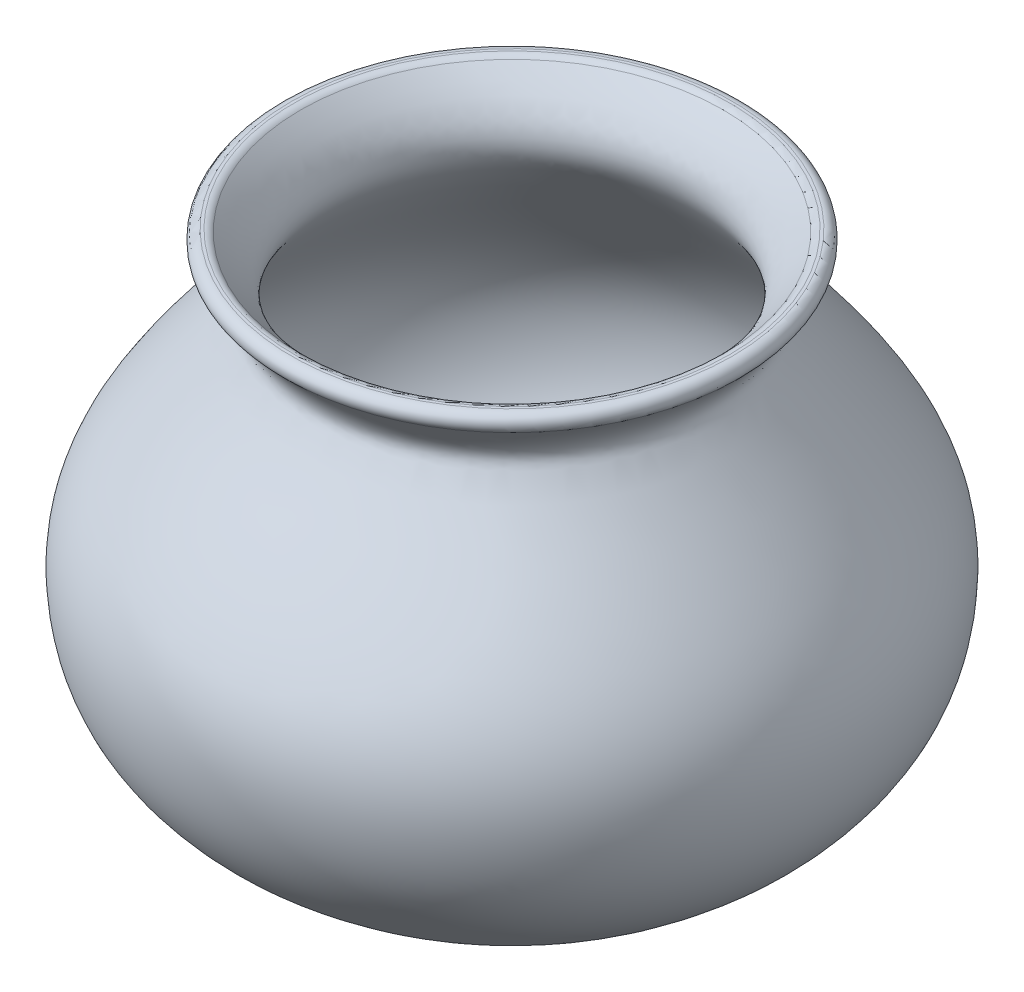
ISO-10303-21;
HEADER;
FILE_DESCRIPTION(('STEP AP214'),'2;1');
FILE_NAME('part.step','',(''),(''),'','','');
FILE_SCHEMA(('AUTOMOTIVE_DESIGN { 1 0 10303 214 1 1 1 1 }'));
ENDSEC;
DATA;
#1=APPLICATION_CONTEXT('core data for automotive mechanical design processes');
#2=APPLICATION_PROTOCOL_DEFINITION('international standard','automotive_design',2000,#1);
#3=PRODUCT_CONTEXT('',#1,'mechanical');
#4=PRODUCT('Part','Part','',(#3));
#5=PRODUCT_RELATED_PRODUCT_CATEGORY('part','',(#4));
#6=PRODUCT_DEFINITION_FORMATION('','',#4);
#7=PRODUCT_DEFINITION_CONTEXT('part definition',#1,'design');
#8=PRODUCT_DEFINITION('design','',#6,#7);
#9=PRODUCT_DEFINITION_SHAPE('','',#8);
#10=(LENGTH_UNIT() NAMED_UNIT(*) SI_UNIT(.MILLI.,.METRE.));
#11=(NAMED_UNIT(*) PLANE_ANGLE_UNIT() SI_UNIT($,.RADIAN.));
#12=(NAMED_UNIT(*) SI_UNIT($,.STERADIAN.) SOLID_ANGLE_UNIT());
#13=UNCERTAINTY_MEASURE_WITH_UNIT(LENGTH_MEASURE(1.E-05),#10,'distance_accuracy_value','');
#14=(GEOMETRIC_REPRESENTATION_CONTEXT(3) GLOBAL_UNCERTAINTY_ASSIGNED_CONTEXT((#13)) GLOBAL_UNIT_ASSIGNED_CONTEXT((#10,
#11,#12)) REPRESENTATION_CONTEXT('',''));
#15=CARTESIAN_POINT('',(0.,0.,0.));
#16=DIRECTION('',(0.,0.,1.));
#17=DIRECTION('',(1.,0.,0.));
#18=AXIS2_PLACEMENT_3D('',#15,#16,#17);
#19=CARTESIAN_POINT('',(0.,209.126185622765,-0.00765114113669776));
#20=DIRECTION('',(0.,-1.,0.));
#21=DIRECTION('',(1.,0.,0.));
#22=AXIS2_PLACEMENT_3D('',#19,#20,#21);
#23=PLANE('',#22);
#24=CARTESIAN_POINT('',(0.,209.126185622765,-0.00765114113669776));
#25=DIRECTION('',(0.,-1.,0.));
#26=DIRECTION('',(1.,0.,0.));
#27=AXIS2_PLACEMENT_3D('',#24,#25,#26);
#28=CIRCLE('',#27,89.7910064098729);
#29=CARTESIAN_POINT('',(89.7910064098728,209.126185622765,-0.00765114113669776));
#30=VERTEX_POINT('',#29);
#31=EDGE_CURVE('E93',#30,#30,#28,.F.);
#32=ORIENTED_EDGE('',*,*,#31,.T.);
#33=EDGE_LOOP('',(#32));
#34=FACE_BOUND('',#33,.T.);
#35=CARTESIAN_POINT('',(0.,209.126185622765,-0.00765114113669776));
#36=DIRECTION('',(0.,-1.,0.));
#37=DIRECTION('',(1.,0.,0.));
#38=AXIS2_PLACEMENT_3D('',#35,#36,#37);
#39=CIRCLE('',#38,88.6744297814408);
#40=CARTESIAN_POINT('',(88.6744297814408,209.126185622765,-0.00765114113669776));
#41=VERTEX_POINT('',#40);
#42=EDGE_CURVE('E87',#41,#41,#39,.T.);
#43=ORIENTED_EDGE('',*,*,#42,.T.);
#44=EDGE_LOOP('',(#43));
#45=FACE_BOUND('',#44,.T.);
#46=ADVANCED_FACE('F42',(#34,#45),#23,.F.);
#47=CARTESIAN_POINT('',(-2.27545171794154E-13,-4.23381437723537,-0.00765114113669776));
#48=CARTESIAN_POINT('',(17.0085612485199,-4.14377991760639,-0.00765114113669776));
#49=CARTESIAN_POINT('',(33.2490660723946,-1.4205350583226,-0.00765114113669776));
#50=CARTESIAN_POINT('',(64.8944542503649,6.20074467689256,-0.00765114113669776));
#51=CARTESIAN_POINT('',(124.831732128497,31.5800255656868,-0.00765114113669776));
#52=CARTESIAN_POINT('',(136.251179781009,93.640265937534,-0.00765114113669776));
#53=CARTESIAN_POINT('',(128.374972054001,127.37656177981,-0.00765114113669776));
#54=CARTESIAN_POINT('',(88.9657364865783,170.743340545911,-0.00765114113669776));
#55=CARTESIAN_POINT('',(79.3792931348029,187.417415181726,-0.00765114113669776));
#56=CARTESIAN_POINT('',(88.3982597834381,199.421967828531,-0.00765114113669776));
#57=CARTESIAN_POINT('',(96.7996082656881,206.519344267234,-0.00765114113669776));
#58=CARTESIAN_POINT('',(99.06,209.126185622765,-0.00765114113669776));
#59=B_SPLINE_CURVE_WITH_KNOTS('',3,(#47,#48,#49,#50,#51,#52,#53,#54,#55,#56,#57,#58),
.UNSPECIFIED.,.F.,.F.,(4,1,1,1,1,1,1,1,1,4),(0.,0.184861889340117,0.247829769261942,
0.587251129223108,0.642982067214919,0.762711479184906,0.900457012899512,0.919817645616506,
0.956317806354846,1.),.UNSPECIFIED.);
#60=CARTESIAN_POINT('',(0.,209.126185622765,-0.00765114113669776));
#61=DIRECTION('',(0.,1.,0.));
#62=AXIS1_PLACEMENT('',#60,#61);
#63=SURFACE_OF_REVOLUTION('',#59,#62);
#64=CARTESIAN_POINT('',(0.,202.584217575306,-0.00765114113669776));
#65=DIRECTION('',(0.,1.,0.));
#66=DIRECTION('',(-1.,0.,0.));
#67=AXIS2_PLACEMENT_3D('',#64,#65,#66);
#68=CIRCLE('',#67,92.4466514516026);
#69=CARTESIAN_POINT('',(-92.4466514516026,202.584217575306,-0.00765114113669776));
#70=VERTEX_POINT('',#69);
#71=EDGE_CURVE('E50',#70,#70,#68,.F.);
#72=ORIENTED_EDGE('',*,*,#71,.T.);
#73=EDGE_LOOP('',(#72));
#74=FACE_BOUND('',#73,.T.);
#75=CARTESIAN_POINT('',(0.,-4.23381437723537,-0.00765114113669776));
#76=VERTEX_POINT('',#75);
#77=VERTEX_LOOP('',#76);
#78=FACE_BOUND('',#77,.T.);
#79=ADVANCED_FACE('F59',(#74,#78),#63,.T.);
#80=CARTESIAN_POINT('',(0.0462255059895678,-4.23356483875475,-0.00765114113669776));
#81=CARTESIAN_POINT('',(17.0305147315768,-4.14009826120007,-0.00765114113669776));
#82=CARTESIAN_POINT('',(33.2580930015146,-1.4183610684955,-0.00765114113669776));
#83=CARTESIAN_POINT('',(64.8944542503649,6.20074467689256,-0.00765114113669776));
#84=CARTESIAN_POINT('',(124.831732128497,31.5800255656868,-0.00765114113669776));
#85=CARTESIAN_POINT('',(136.251179781009,93.640265937534,-0.00765114113669776));
#86=CARTESIAN_POINT('',(128.374972054001,127.37656177981,-0.00765114113669776));
#87=CARTESIAN_POINT('',(88.9657364865783,170.743340545911,-0.00765114113669776));
#88=CARTESIAN_POINT('',(79.3792931348029,187.417415181726,-0.00765114113669776));
#89=CARTESIAN_POINT('',(88.3982597834381,199.421967828531,-0.00765114113669776));
#90=CARTESIAN_POINT('',(96.7996082656881,206.519344267234,-0.00765114113669776));
#91=CARTESIAN_POINT('',(99.06,209.126185622765,-0.00765114113669776));
#92=B_SPLINE_CURVE_WITH_KNOTS('',3,(#80,#81,#82,#83,#84,#85,#86,#87,#88,#89,#90,#91),
.UNSPECIFIED.,.F.,.F.,(4,1,1,1,1,1,1,1,1,4),(0.000167514908944352,0.184861889340117,
0.247829769261942,0.587251129223108,0.642982067214919,0.762711479184906,0.900457012899512,
0.919817645616506,0.956317806354846,1.),.UNSPECIFIED.);
#93=CARTESIAN_POINT('',(0.,209.126185622765,-0.00765114113669776));
#94=DIRECTION('',(0.,1.,0.));
#95=AXIS1_PLACEMENT('',#93,#94);
#96=SURFACE_OF_REVOLUTION('',#92,#95);
#97=OFFSET_SURFACE('',#96,-8.4,.F.);
#98=CARTESIAN_POINT('',(0.,208.036339411358,-0.00765114113669776));
#99=DIRECTION('',(0.,1.,0.));
#100=DIRECTION('',(-1.,0.,0.));
#101=AXIS2_PLACEMENT_3D('',#98,#99,#100);
#102=CIRCLE('',#101,86.0066847849317);
#103=CARTESIAN_POINT('',(-86.0066847849318,208.036339411358,-0.00765114113669776));
#104=VERTEX_POINT('',#103);
#105=EDGE_CURVE('E11',#104,#104,#102,.T.);
#106=ORIENTED_EDGE('',*,*,#105,.T.);
#107=EDGE_LOOP('',(#106));
#108=FACE_BOUND('',#107,.T.);
#109=CARTESIAN_POINT('',(0.,4.16630796996063,-0.00765114113669776));
#110=VERTEX_POINT('',#109);
#111=VERTEX_LOOP('',#110);
#112=FACE_BOUND('',#111,.T.);
#113=ADVANCED_FACE('F56',(#108,#112),#97,.F.);
#114=CARTESIAN_POINT('',(0.,205.316185622765,-0.00765114113669776));
#115=DIRECTION('',(0.,1.,0.));
#116=DIRECTION('',(-1.,0.,0.));
#117=AXIS2_PLACEMENT_3D('',#114,#115,#116);
#118=TOROIDAL_SURFACE('',#117,89.7910064098729,3.81);
#119=ORIENTED_EDGE('',*,*,#71,.F.);
#120=EDGE_LOOP('',(#119));
#121=FACE_BOUND('',#120,.T.);
#122=ORIENTED_EDGE('',*,*,#31,.F.);
#123=EDGE_LOOP('',(#122));
#124=FACE_BOUND('',#123,.T.);
#125=ADVANCED_FACE('F58',(#121,#124),#118,.T.);
#126=CARTESIAN_POINT('',(0.,205.316185622765,-0.00765114113669776));
#127=DIRECTION('',(0.,1.,0.));
#128=DIRECTION('',(-1.,0.,0.));
#129=AXIS2_PLACEMENT_3D('',#126,#127,#128);
#130=TOROIDAL_SURFACE('',#129,88.6744297814408,3.81);
#131=ORIENTED_EDGE('',*,*,#42,.F.);
#132=EDGE_LOOP('',(#131));
#133=FACE_BOUND('',#132,.T.);
#134=ORIENTED_EDGE('',*,*,#105,.F.);
#135=EDGE_LOOP('',(#134));
#136=FACE_BOUND('',#135,.T.);
#137=ADVANCED_FACE('F44',(#133,#136),#130,.T.);
#138=CLOSED_SHELL('',(#46,#79,#113,#125,#137));
#139=MANIFOLD_SOLID_BREP('B2',#138);
#140=ADVANCED_BREP_SHAPE_REPRESENTATION('',(#18,#139),#14);
#141=SHAPE_DEFINITION_REPRESENTATION(#9,#140);
ENDSEC;
END-ISO-10303-21;
